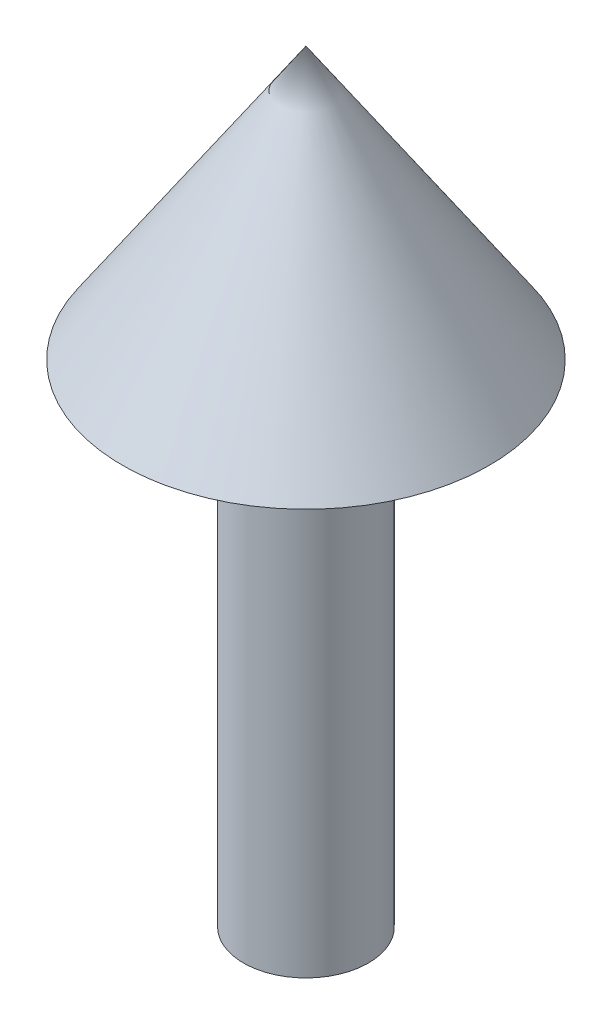
ISO-10303-21;
HEADER;
FILE_DESCRIPTION(('STEP AP214'),'2;1');
FILE_NAME('part.step','',(''),(''),'','','');
FILE_SCHEMA(('AUTOMOTIVE_DESIGN { 1 0 10303 214 1 1 1 1 }'));
ENDSEC;
DATA;
#1=APPLICATION_CONTEXT('core data for automotive mechanical design processes');
#2=APPLICATION_PROTOCOL_DEFINITION('international standard','automotive_design',2000,#1);
#3=PRODUCT_CONTEXT('',#1,'mechanical');
#4=PRODUCT('Part','Part','',(#3));
#5=PRODUCT_RELATED_PRODUCT_CATEGORY('part','',(#4));
#6=PRODUCT_DEFINITION_FORMATION('','',#4);
#7=PRODUCT_DEFINITION_CONTEXT('part definition',#1,'design');
#8=PRODUCT_DEFINITION('design','',#6,#7);
#9=PRODUCT_DEFINITION_SHAPE('','',#8);
#10=(LENGTH_UNIT() NAMED_UNIT(*) SI_UNIT(.MILLI.,.METRE.));
#11=(NAMED_UNIT(*) PLANE_ANGLE_UNIT() SI_UNIT($,.RADIAN.));
#12=(NAMED_UNIT(*) SI_UNIT($,.STERADIAN.) SOLID_ANGLE_UNIT());
#13=UNCERTAINTY_MEASURE_WITH_UNIT(LENGTH_MEASURE(1.E-05),#10,'distance_accuracy_value','');
#14=(GEOMETRIC_REPRESENTATION_CONTEXT(3) GLOBAL_UNCERTAINTY_ASSIGNED_CONTEXT((#13)) GLOBAL_UNIT_ASSIGNED_CONTEXT((#10,
#11,#12)) REPRESENTATION_CONTEXT('',''));
#15=CARTESIAN_POINT('',(0.,0.,0.));
#16=DIRECTION('',(0.,0.,1.));
#17=DIRECTION('',(1.,0.,0.));
#18=AXIS2_PLACEMENT_3D('',#15,#16,#17);
#19=CARTESIAN_POINT('',(11.7310389528129,31.4375588658756,0.));
#20=DIRECTION('',(0.,1.,0.));
#21=DIRECTION('',(0.,0.,1.));
#22=AXIS2_PLACEMENT_3D('',#19,#20,#21);
#23=PLANE('',#22);
#24=CARTESIAN_POINT('',(0.,31.4375588658756,0.));
#25=DIRECTION('',(0.,-1.,0.));
#26=DIRECTION('',(0.,0.,-1.));
#27=AXIS2_PLACEMENT_3D('',#24,#25,#26);
#28=CIRCLE('',#27,4.);
#29=CARTESIAN_POINT('',(0.,31.4375588658756,-4.));
#30=VERTEX_POINT('',#29);
#31=EDGE_CURVE('E11',#30,#30,#28,.T.);
#32=ORIENTED_EDGE('',*,*,#31,.F.);
#33=EDGE_LOOP('',(#32));
#34=FACE_BOUND('',#33,.T.);
#35=CARTESIAN_POINT('',(0.,31.4375588658756,0.));
#36=DIRECTION('',(0.,-1.,0.));
#37=DIRECTION('',(0.,0.,-1.));
#38=AXIS2_PLACEMENT_3D('',#35,#36,#37);
#39=CIRCLE('',#38,11.7310389528129);
#40=CARTESIAN_POINT('',(0.,31.4375588658756,-11.7310389528129));
#41=VERTEX_POINT('',#40);
#42=EDGE_CURVE('E42',#41,#41,#39,.T.);
#43=ORIENTED_EDGE('',*,*,#42,.T.);
#44=EDGE_LOOP('',(#43));
#45=FACE_BOUND('',#44,.T.);
#46=ADVANCED_FACE('F34',(#34,#45),#23,.F.);
#47=CARTESIAN_POINT('',(0.,48.8128291306465,0.));
#48=DIRECTION('',(0.,-1.,0.));
#49=DIRECTION('',(0.,0.,-1.));
#50=AXIS2_PLACEMENT_3D('',#47,#48,#49);
#51=CONICAL_SURFACE('',#50,0.,0.593857658888815);
#52=ORIENTED_EDGE('',*,*,#42,.F.);
#53=EDGE_LOOP('',(#52));
#54=FACE_BOUND('',#53,.T.);
#55=CARTESIAN_POINT('',(0.,48.8128291306465,0.));
#56=VERTEX_POINT('',#55);
#57=VERTEX_LOOP('',#56);
#58=FACE_BOUND('',#57,.T.);
#59=ADVANCED_FACE('F45',(#54,#58),#51,.T.);
#60=CARTESIAN_POINT('',(0.,0.,0.));
#61=DIRECTION('',(0.,-1.,0.));
#62=DIRECTION('',(0.,0.,-1.));
#63=AXIS2_PLACEMENT_3D('',#60,#61,#62);
#64=PLANE('',#63);
#65=CARTESIAN_POINT('',(0.,0.,0.));
#66=DIRECTION('',(0.,-1.,0.));
#67=DIRECTION('',(0.,0.,-1.));
#68=AXIS2_PLACEMENT_3D('',#65,#66,#67);
#69=CIRCLE('',#68,4.);
#70=CARTESIAN_POINT('',(0.,0.,-4.));
#71=VERTEX_POINT('',#70);
#72=EDGE_CURVE('E38',#71,#71,#69,.T.);
#73=ORIENTED_EDGE('',*,*,#72,.T.);
#74=EDGE_LOOP('',(#73));
#75=FACE_BOUND('',#74,.T.);
#76=ADVANCED_FACE('F36',(#75),#64,.T.);
#77=CARTESIAN_POINT('',(0.,31.4375588658756,0.));
#78=DIRECTION('',(0.,-1.,0.));
#79=DIRECTION('',(0.,0.,-1.));
#80=AXIS2_PLACEMENT_3D('',#77,#78,#79);
#81=CYLINDRICAL_SURFACE('',#80,4.);
#82=ORIENTED_EDGE('',*,*,#72,.F.);
#83=EDGE_LOOP('',(#82));
#84=FACE_BOUND('',#83,.T.);
#85=ORIENTED_EDGE('',*,*,#31,.T.);
#86=EDGE_LOOP('',(#85));
#87=FACE_BOUND('',#86,.T.);
#88=ADVANCED_FACE('F53',(#84,#87),#81,.T.);
#89=CLOSED_SHELL('',(#46,#59,#76,#88));
#90=MANIFOLD_SOLID_BREP('B2',#89);
#91=ADVANCED_BREP_SHAPE_REPRESENTATION('',(#18,#90),#14);
#92=SHAPE_DEFINITION_REPRESENTATION(#9,#91);
ENDSEC;
END-ISO-10303-21;
